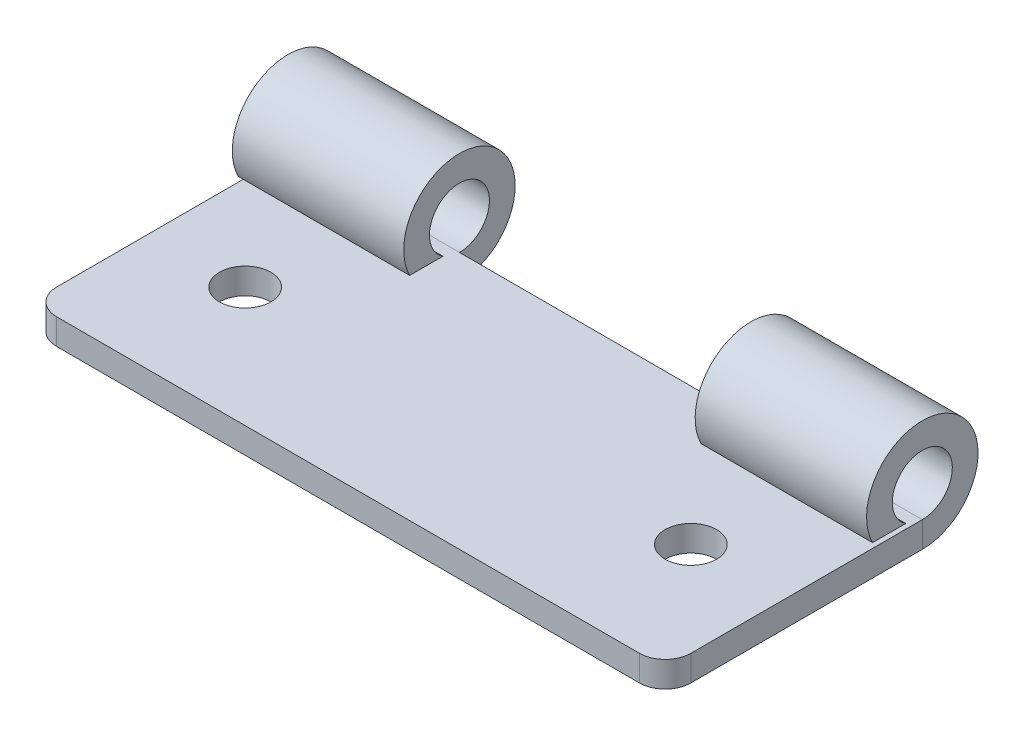
ISO-10303-21;
HEADER;
FILE_DESCRIPTION(('STEP AP214'),'2;1');
FILE_NAME('part.step','',(''),(''),'','','');
FILE_SCHEMA(('AUTOMOTIVE_DESIGN { 1 0 10303 214 1 1 1 1 }'));
ENDSEC;
DATA;
#1=APPLICATION_CONTEXT('core data for automotive mechanical design processes');
#2=APPLICATION_PROTOCOL_DEFINITION('international standard','automotive_design',2000,#1);
#3=PRODUCT_CONTEXT('',#1,'mechanical');
#4=PRODUCT('Part','Part','',(#3));
#5=PRODUCT_RELATED_PRODUCT_CATEGORY('part','',(#4));
#6=PRODUCT_DEFINITION_FORMATION('','',#4);
#7=PRODUCT_DEFINITION_CONTEXT('part definition',#1,'design');
#8=PRODUCT_DEFINITION('design','',#6,#7);
#9=PRODUCT_DEFINITION_SHAPE('','',#8);
#10=(LENGTH_UNIT() NAMED_UNIT(*) SI_UNIT(.MILLI.,.METRE.));
#11=(NAMED_UNIT(*) PLANE_ANGLE_UNIT() SI_UNIT($,.RADIAN.));
#12=(NAMED_UNIT(*) SI_UNIT($,.STERADIAN.) SOLID_ANGLE_UNIT());
#13=UNCERTAINTY_MEASURE_WITH_UNIT(LENGTH_MEASURE(1.E-05),#10,'distance_accuracy_value','');
#14=(GEOMETRIC_REPRESENTATION_CONTEXT(3) GLOBAL_UNCERTAINTY_ASSIGNED_CONTEXT((#13)) GLOBAL_UNIT_ASSIGNED_CONTEXT((#10,
#11,#12)) REPRESENTATION_CONTEXT('',''));
#15=CARTESIAN_POINT('',(0.,0.,0.));
#16=DIRECTION('',(0.,0.,1.));
#17=DIRECTION('',(1.,0.,0.));
#18=AXIS2_PLACEMENT_3D('',#15,#16,#17);
#19=CARTESIAN_POINT('',(0.,1.75,-15.));
#20=DIRECTION('',(1.,0.,0.));
#21=DIRECTION('',(0.,0.,-1.));
#22=AXIS2_PLACEMENT_3D('',#19,#20,#21);
#23=CYLINDRICAL_SURFACE('',#22,1.75);
#24=CARTESIAN_POINT('',(10.,1.75,-15.));
#25=DIRECTION('',(1.,0.,0.));
#26=DIRECTION('',(0.,0.,-1.));
#27=AXIS2_PLACEMENT_3D('',#24,#25,#26);
#28=CIRCLE('',#27,1.75);
#29=CARTESIAN_POINT('',(10.,0.,-15.));
#30=VERTEX_POINT('',#29);
#31=CARTESIAN_POINT('',(10.,0.289826786247609,-14.0354305697152));
#32=VERTEX_POINT('',#31);
#33=EDGE_CURVE('E64',#30,#32,#28,.T.);
#34=ORIENTED_EDGE('',*,*,#33,.T.);
#35=DIRECTION('',(1.,0.,0.));
#36=VECTOR('',#35,1.);
#37=CARTESIAN_POINT('',(0.,0.289826786247609,-14.0354305697152));
#38=LINE('',#37,#36);
#39=CARTESIAN_POINT('',(0.,0.289826786247609,-14.0354305697152));
#40=VERTEX_POINT('',#39);
#41=EDGE_CURVE('E96',#40,#32,#38,.T.);
#42=ORIENTED_EDGE('',*,*,#41,.F.);
#43=CARTESIAN_POINT('',(0.,1.75,-15.));
#44=DIRECTION('',(-1.,0.,0.));
#45=DIRECTION('',(0.,0.,-1.));
#46=AXIS2_PLACEMENT_3D('',#43,#44,#45);
#47=CIRCLE('',#46,1.75);
#48=CARTESIAN_POINT('',(0.,0.,-15.));
#49=VERTEX_POINT('',#48);
#50=EDGE_CURVE('E87',#40,#49,#47,.T.);
#51=ORIENTED_EDGE('',*,*,#50,.T.);
#52=DIRECTION('',(1.,0.,0.));
#53=VECTOR('',#52,1.);
#54=CARTESIAN_POINT('',(0.,0.,-15.));
#55=LINE('',#54,#53);
#56=EDGE_CURVE('E51',#49,#30,#55,.T.);
#57=ORIENTED_EDGE('',*,*,#56,.T.);
#58=EDGE_LOOP('',(#34,#42,#51,#57));
#59=FACE_BOUND('',#58,.T.);
#60=ADVANCED_FACE('F48',(#59),#23,.F.);
#61=CARTESIAN_POINT('',(0.,1.75,-15.));
#62=DIRECTION('',(1.,0.,0.));
#63=DIRECTION('',(0.,0.,-1.));
#64=AXIS2_PLACEMENT_3D('',#61,#62,#63);
#65=CYLINDRICAL_SURFACE('',#64,3.25);
#66=DIRECTION('',(1.,0.,0.));
#67=VECTOR('',#66,1.);
#68=CARTESIAN_POINT('',(0.,0.289826786247611,-12.0964858901944));
#69=LINE('',#68,#67);
#70=CARTESIAN_POINT('',(0.,0.289826786247611,-12.0964858901944));
#71=VERTEX_POINT('',#70);
#72=CARTESIAN_POINT('',(10.,0.289826786247609,-12.0964858901944));
#73=VERTEX_POINT('',#72);
#74=EDGE_CURVE('E103',#71,#73,#69,.T.);
#75=ORIENTED_EDGE('',*,*,#74,.T.);
#76=CARTESIAN_POINT('',(10.,1.75,-15.));
#77=DIRECTION('',(1.,0.,0.));
#78=DIRECTION('',(0.,0.,-1.));
#79=AXIS2_PLACEMENT_3D('',#76,#77,#78);
#80=CIRCLE('',#79,3.25);
#81=CARTESIAN_POINT('',(10.,-1.5,-15.));
#82=VERTEX_POINT('',#81);
#83=EDGE_CURVE('E111',#73,#82,#80,.F.);
#84=ORIENTED_EDGE('',*,*,#83,.T.);
#85=DIRECTION('',(1.,0.,0.));
#86=VECTOR('',#85,1.);
#87=CARTESIAN_POINT('',(0.,-1.5,-15.));
#88=LINE('',#87,#86);
#89=CARTESIAN_POINT('',(0.,-1.5,-15.));
#90=VERTEX_POINT('',#89);
#91=EDGE_CURVE('E99',#90,#82,#88,.T.);
#92=ORIENTED_EDGE('',*,*,#91,.F.);
#93=CARTESIAN_POINT('',(0.,1.75,-15.));
#94=DIRECTION('',(1.,0.,0.));
#95=DIRECTION('',(0.,0.,-1.));
#96=AXIS2_PLACEMENT_3D('',#93,#94,#95);
#97=CIRCLE('',#96,3.25);
#98=EDGE_CURVE('E105',#90,#71,#97,.T.);
#99=ORIENTED_EDGE('',*,*,#98,.T.);
#100=EDGE_LOOP('',(#75,#84,#92,#99));
#101=FACE_BOUND('',#100,.T.);
#102=ADVANCED_FACE('F122',(#101),#65,.T.);
#103=CARTESIAN_POINT('',(0.,0.289826786247609,-14.0354305697152));
#104=DIRECTION('',(0.,-1.,0.));
#105=DIRECTION('',(0.,0.,-1.));
#106=AXIS2_PLACEMENT_3D('',#103,#104,#105);
#107=PLANE('',#106);
#108=DIRECTION('',(0.,0.,-1.));
#109=VECTOR('',#108,1.);
#110=CARTESIAN_POINT('',(10.,0.289826786247609,-14.0354305697152));
#111=LINE('',#110,#109);
#112=EDGE_CURVE('E12',#73,#32,#111,.T.);
#113=ORIENTED_EDGE('',*,*,#112,.F.);
#114=ORIENTED_EDGE('',*,*,#74,.F.);
#115=DIRECTION('',(0.,0.,-1.));
#116=VECTOR('',#115,1.);
#117=CARTESIAN_POINT('',(0.,0.289826786247609,-14.0354305697152));
#118=LINE('',#117,#116);
#119=EDGE_CURVE('E91',#71,#40,#118,.T.);
#120=ORIENTED_EDGE('',*,*,#119,.T.);
#121=ORIENTED_EDGE('',*,*,#41,.T.);
#122=EDGE_LOOP('',(#113,#114,#120,#121));
#123=FACE_BOUND('',#122,.T.);
#124=ADVANCED_FACE('F101',(#123),#107,.T.);
#125=CARTESIAN_POINT('',(0.,0.,-15.));
#126=DIRECTION('',(0.,0.,1.));
#127=DIRECTION('',(1.,0.,0.));
#128=AXIS2_PLACEMENT_3D('',#125,#126,#127);
#129=PLANE('',#128);
#130=ORIENTED_EDGE('',*,*,#91,.T.);
#131=DIRECTION('',(0.,1.,0.));
#132=VECTOR('',#131,1.);
#133=CARTESIAN_POINT('',(10.,0.,-15.));
#134=LINE('',#133,#132);
#135=EDGE_CURVE('E109',#82,#30,#134,.T.);
#136=ORIENTED_EDGE('',*,*,#135,.T.);
#137=ORIENTED_EDGE('',*,*,#56,.F.);
#138=DIRECTION('',(0.,-1.,0.));
#139=VECTOR('',#138,1.);
#140=CARTESIAN_POINT('',(0.,0.,-15.));
#141=LINE('',#140,#139);
#142=EDGE_CURVE('E57',#49,#90,#141,.T.);
#143=ORIENTED_EDGE('',*,*,#142,.T.);
#144=EDGE_LOOP('',(#130,#136,#137,#143));
#145=FACE_BOUND('',#144,.T.);
#146=ADVANCED_FACE('F118',(#145),#129,.T.);
#147=CARTESIAN_POINT('',(0.,1.75,-15.));
#148=DIRECTION('',(1.,0.,0.));
#149=DIRECTION('',(0.,0.,-1.));
#150=AXIS2_PLACEMENT_3D('',#147,#148,#149);
#151=PLANE('',#150);
#152=ORIENTED_EDGE('',*,*,#50,.F.);
#153=ORIENTED_EDGE('',*,*,#119,.F.);
#154=ORIENTED_EDGE('',*,*,#98,.F.);
#155=ORIENTED_EDGE('',*,*,#142,.F.);
#156=EDGE_LOOP('',(#152,#153,#154,#155));
#157=FACE_BOUND('',#156,.T.);
#158=ADVANCED_FACE('F88',(#157),#151,.F.);
#159=CARTESIAN_POINT('',(10.,10.,-15.));
#160=DIRECTION('',(1.,0.,0.));
#161=DIRECTION('',(0.,0.,-1.));
#162=AXIS2_PLACEMENT_3D('',#159,#160,#161);
#163=PLANE('',#162);
#164=ORIENTED_EDGE('',*,*,#135,.F.);
#165=ORIENTED_EDGE('',*,*,#83,.F.);
#166=ORIENTED_EDGE('',*,*,#112,.T.);
#167=ORIENTED_EDGE('',*,*,#33,.F.);
#168=EDGE_LOOP('',(#164,#165,#166,#167));
#169=FACE_BOUND('',#168,.T.);
#170=ADVANCED_FACE('F120',(#169),#163,.T.);
#171=CLOSED_SHELL('',(#60,#102,#124,#146,#158,#170));
#172=MANIFOLD_SOLID_BREP('B2',#171);
#173=CARTESIAN_POINT('',(37.,1.75,-15.));
#174=DIRECTION('',(1.,0.,0.));
#175=DIRECTION('',(0.,0.,-1.));
#176=AXIS2_PLACEMENT_3D('',#173,#174,#175);
#177=PLANE('',#176);
#178=CARTESIAN_POINT('',(37.,1.75,-15.));
#179=DIRECTION('',(-1.,0.,0.));
#180=DIRECTION('',(0.,0.,-1.));
#181=AXIS2_PLACEMENT_3D('',#178,#179,#180);
#182=CIRCLE('',#181,1.75);
#183=CARTESIAN_POINT('',(37.,0.289826786247609,-14.0354305697152));
#184=VERTEX_POINT('',#183);
#185=CARTESIAN_POINT('',(37.,0.,-15.));
#186=VERTEX_POINT('',#185);
#187=EDGE_CURVE('E250',#184,#186,#182,.T.);
#188=ORIENTED_EDGE('',*,*,#187,.T.);
#189=DIRECTION('',(0.,-1.,0.));
#190=VECTOR('',#189,1.);
#191=CARTESIAN_POINT('',(37.,0.,-15.));
#192=LINE('',#191,#190);
#193=CARTESIAN_POINT('',(37.,-1.5,-15.));
#194=VERTEX_POINT('',#193);
#195=EDGE_CURVE('E242',#186,#194,#192,.T.);
#196=ORIENTED_EDGE('',*,*,#195,.T.);
#197=CARTESIAN_POINT('',(37.,1.75,-15.));
#198=DIRECTION('',(1.,0.,0.));
#199=DIRECTION('',(0.,0.,-1.));
#200=AXIS2_PLACEMENT_3D('',#197,#198,#199);
#201=CIRCLE('',#200,3.25);
#202=CARTESIAN_POINT('',(37.,0.289826786247611,-12.0964858901944));
#203=VERTEX_POINT('',#202);
#204=EDGE_CURVE('E262',#194,#203,#201,.T.);
#205=ORIENTED_EDGE('',*,*,#204,.T.);
#206=DIRECTION('',(0.,0.,-1.));
#207=VECTOR('',#206,1.);
#208=CARTESIAN_POINT('',(37.,0.289826786247609,-14.0354305697152));
#209=LINE('',#208,#207);
#210=EDGE_CURVE('E258',#203,#184,#209,.T.);
#211=ORIENTED_EDGE('',*,*,#210,.T.);
#212=EDGE_LOOP('',(#188,#196,#205,#211));
#213=FACE_BOUND('',#212,.T.);
#214=ADVANCED_FACE('F197',(#213),#177,.T.);
#215=CARTESIAN_POINT('',(0.,0.,-15.));
#216=DIRECTION('',(0.,0.,1.));
#217=DIRECTION('',(1.,0.,0.));
#218=AXIS2_PLACEMENT_3D('',#215,#216,#217);
#219=PLANE('',#218);
#220=DIRECTION('',(1.,0.,0.));
#221=VECTOR('',#220,1.);
#222=CARTESIAN_POINT('',(0.,0.,-15.));
#223=LINE('',#222,#221);
#224=CARTESIAN_POINT('',(27.,0.,-15.));
#225=VERTEX_POINT('',#224);
#226=EDGE_CURVE('E257',#225,#186,#223,.T.);
#227=ORIENTED_EDGE('',*,*,#226,.F.);
#228=DIRECTION('',(0.,-1.,0.));
#229=VECTOR('',#228,1.);
#230=CARTESIAN_POINT('',(27.,0.,-15.));
#231=LINE('',#230,#229);
#232=CARTESIAN_POINT('',(27.,-1.5,-15.));
#233=VERTEX_POINT('',#232);
#234=EDGE_CURVE('E46',#225,#233,#231,.T.);
#235=ORIENTED_EDGE('',*,*,#234,.T.);
#236=DIRECTION('',(1.,0.,0.));
#237=VECTOR('',#236,1.);
#238=CARTESIAN_POINT('',(0.,-1.5,-15.));
#239=LINE('',#238,#237);
#240=EDGE_CURVE('E252',#233,#194,#239,.T.);
#241=ORIENTED_EDGE('',*,*,#240,.T.);
#242=ORIENTED_EDGE('',*,*,#195,.F.);
#243=EDGE_LOOP('',(#227,#235,#241,#242));
#244=FACE_BOUND('',#243,.T.);
#245=ADVANCED_FACE('F199',(#244),#219,.T.);
#246=CARTESIAN_POINT('',(27.,10.,-15.));
#247=DIRECTION('',(-1.,0.,0.));
#248=DIRECTION('',(0.,0.,1.));
#249=AXIS2_PLACEMENT_3D('',#246,#247,#248);
#250=PLANE('',#249);
#251=CARTESIAN_POINT('',(27.,1.75,-15.));
#252=DIRECTION('',(-1.,0.,0.));
#253=DIRECTION('',(0.,0.,1.));
#254=AXIS2_PLACEMENT_3D('',#251,#252,#253);
#255=CIRCLE('',#254,1.75);
#256=CARTESIAN_POINT('',(27.,0.289826786247609,-14.0354305697152));
#257=VERTEX_POINT('',#256);
#258=EDGE_CURVE('E236',#257,#225,#255,.T.);
#259=ORIENTED_EDGE('',*,*,#258,.F.);
#260=DIRECTION('',(0.,0.,1.));
#261=VECTOR('',#260,1.);
#262=CARTESIAN_POINT('',(27.,0.289826786247609,-14.0354305697152));
#263=LINE('',#262,#261);
#264=CARTESIAN_POINT('',(27.,0.289826786247609,-12.0964858901944));
#265=VERTEX_POINT('',#264);
#266=EDGE_CURVE('E238',#257,#265,#263,.T.);
#267=ORIENTED_EDGE('',*,*,#266,.T.);
#268=CARTESIAN_POINT('',(27.,1.75,-15.));
#269=DIRECTION('',(-1.,0.,0.));
#270=DIRECTION('',(0.,0.,1.));
#271=AXIS2_PLACEMENT_3D('',#268,#269,#270);
#272=CIRCLE('',#271,3.25);
#273=EDGE_CURVE('E212',#233,#265,#272,.F.);
#274=ORIENTED_EDGE('',*,*,#273,.F.);
#275=ORIENTED_EDGE('',*,*,#234,.F.);
#276=EDGE_LOOP('',(#259,#267,#274,#275));
#277=FACE_BOUND('',#276,.T.);
#278=ADVANCED_FACE('F237',(#277),#250,.T.);
#279=CARTESIAN_POINT('',(0.,0.289826786247609,-14.0354305697152));
#280=DIRECTION('',(0.,-1.,0.));
#281=DIRECTION('',(0.,0.,-1.));
#282=AXIS2_PLACEMENT_3D('',#279,#280,#281);
#283=PLANE('',#282);
#284=ORIENTED_EDGE('',*,*,#266,.F.);
#285=DIRECTION('',(1.,0.,0.));
#286=VECTOR('',#285,1.);
#287=CARTESIAN_POINT('',(0.,0.289826786247609,-14.0354305697152));
#288=LINE('',#287,#286);
#289=EDGE_CURVE('E205',#257,#184,#288,.T.);
#290=ORIENTED_EDGE('',*,*,#289,.T.);
#291=ORIENTED_EDGE('',*,*,#210,.F.);
#292=DIRECTION('',(1.,0.,0.));
#293=VECTOR('',#292,1.);
#294=CARTESIAN_POINT('',(0.,0.289826786247611,-12.0964858901944));
#295=LINE('',#294,#293);
#296=EDGE_CURVE('E245',#265,#203,#295,.T.);
#297=ORIENTED_EDGE('',*,*,#296,.F.);
#298=EDGE_LOOP('',(#284,#290,#291,#297));
#299=FACE_BOUND('',#298,.T.);
#300=ADVANCED_FACE('F244',(#299),#283,.T.);
#301=CARTESIAN_POINT('',(0.,1.75,-15.));
#302=DIRECTION('',(1.,0.,0.));
#303=DIRECTION('',(0.,0.,-1.));
#304=AXIS2_PLACEMENT_3D('',#301,#302,#303);
#305=CYLINDRICAL_SURFACE('',#304,3.25);
#306=ORIENTED_EDGE('',*,*,#273,.T.);
#307=ORIENTED_EDGE('',*,*,#296,.T.);
#308=ORIENTED_EDGE('',*,*,#204,.F.);
#309=ORIENTED_EDGE('',*,*,#240,.F.);
#310=EDGE_LOOP('',(#306,#307,#308,#309));
#311=FACE_BOUND('',#310,.T.);
#312=ADVANCED_FACE('F269',(#311),#305,.T.);
#313=CARTESIAN_POINT('',(0.,1.75,-15.));
#314=DIRECTION('',(1.,0.,0.));
#315=DIRECTION('',(0.,0.,-1.));
#316=AXIS2_PLACEMENT_3D('',#313,#314,#315);
#317=CYLINDRICAL_SURFACE('',#316,1.75);
#318=ORIENTED_EDGE('',*,*,#289,.F.);
#319=ORIENTED_EDGE('',*,*,#258,.T.);
#320=ORIENTED_EDGE('',*,*,#226,.T.);
#321=ORIENTED_EDGE('',*,*,#187,.F.);
#322=EDGE_LOOP('',(#318,#319,#320,#321));
#323=FACE_BOUND('',#322,.T.);
#324=ADVANCED_FACE('F248',(#323),#317,.F.);
#325=CLOSED_SHELL('',(#214,#245,#278,#300,#312,#324));
#326=MANIFOLD_SOLID_BREP('B6',#325);
#327=CARTESIAN_POINT('',(0.,-1.5,0.));
#328=DIRECTION('',(-1.,0.,0.));
#329=DIRECTION('',(0.,0.,1.));
#330=AXIS2_PLACEMENT_3D('',#327,#328,#329);
#331=PLANE('',#330);
#332=DIRECTION('',(0.,0.,1.));
#333=VECTOR('',#332,1.);
#334=CARTESIAN_POINT('',(0.,-1.5,0.));
#335=LINE('',#334,#333);
#336=CARTESIAN_POINT('',(0.,-1.5,-15.));
#337=VERTEX_POINT('',#336);
#338=CARTESIAN_POINT('',(0.,-1.5,-1.5));
#339=VERTEX_POINT('',#338);
#340=EDGE_CURVE('E407',#337,#339,#335,.T.);
#341=ORIENTED_EDGE('',*,*,#340,.T.);
#342=DIRECTION('',(0.,1.,0.));
#343=VECTOR('',#342,1.);
#344=CARTESIAN_POINT('',(0.,-1.5,-1.5));
#345=LINE('',#344,#343);
#346=CARTESIAN_POINT('',(0.,0.,-1.5));
#347=VERTEX_POINT('',#346);
#348=EDGE_CURVE('E421',#339,#347,#345,.T.);
#349=ORIENTED_EDGE('',*,*,#348,.T.);
#350=DIRECTION('',(0.,0.,1.));
#351=VECTOR('',#350,1.);
#352=CARTESIAN_POINT('',(0.,0.,0.));
#353=LINE('',#352,#351);
#354=CARTESIAN_POINT('',(0.,0.,-15.));
#355=VERTEX_POINT('',#354);
#356=EDGE_CURVE('E411',#355,#347,#353,.T.);
#357=ORIENTED_EDGE('',*,*,#356,.F.);
#358=DIRECTION('',(0.,1.,0.));
#359=VECTOR('',#358,1.);
#360=CARTESIAN_POINT('',(0.,-1.5,-15.));
#361=LINE('',#360,#359);
#362=EDGE_CURVE('E402',#337,#355,#361,.T.);
#363=ORIENTED_EDGE('',*,*,#362,.F.);
#364=EDGE_LOOP('',(#341,#349,#357,#363));
#365=FACE_BOUND('',#364,.T.);
#366=ADVANCED_FACE('F337',(#365),#331,.T.);
#367=CARTESIAN_POINT('',(0.,-1.5,-15.));
#368=DIRECTION('',(0.,0.,-1.));
#369=DIRECTION('',(-1.,0.,0.));
#370=AXIS2_PLACEMENT_3D('',#367,#368,#369);
#371=PLANE('',#370);
#372=DIRECTION('',(-1.,0.,0.));
#373=VECTOR('',#372,1.);
#374=CARTESIAN_POINT('',(0.,-1.5,-15.));
#375=LINE('',#374,#373);
#376=CARTESIAN_POINT('',(37.,-1.5,-15.));
#377=VERTEX_POINT('',#376);
#378=EDGE_CURVE('E394',#377,#337,#375,.T.);
#379=ORIENTED_EDGE('',*,*,#378,.T.);
#380=ORIENTED_EDGE('',*,*,#362,.T.);
#381=DIRECTION('',(-1.,0.,0.));
#382=VECTOR('',#381,1.);
#383=CARTESIAN_POINT('',(0.,0.,-15.));
#384=LINE('',#383,#382);
#385=CARTESIAN_POINT('',(37.,0.,-15.));
#386=VERTEX_POINT('',#385);
#387=EDGE_CURVE('E401',#386,#355,#384,.T.);
#388=ORIENTED_EDGE('',*,*,#387,.F.);
#389=DIRECTION('',(0.,1.,0.));
#390=VECTOR('',#389,1.);
#391=CARTESIAN_POINT('',(37.,-1.5,-15.));
#392=LINE('',#391,#390);
#393=EDGE_CURVE('E391',#377,#386,#392,.T.);
#394=ORIENTED_EDGE('',*,*,#393,.F.);
#395=EDGE_LOOP('',(#379,#380,#388,#394));
#396=FACE_BOUND('',#395,.T.);
#397=ADVANCED_FACE('F398',(#396),#371,.T.);
#398=CARTESIAN_POINT('',(37.,-1.5,0.));
#399=DIRECTION('',(1.,0.,0.));
#400=DIRECTION('',(0.,0.,-1.));
#401=AXIS2_PLACEMENT_3D('',#398,#399,#400);
#402=PLANE('',#401);
#403=DIRECTION('',(0.,0.,-1.));
#404=VECTOR('',#403,1.);
#405=CARTESIAN_POINT('',(37.,0.,0.));
#406=LINE('',#405,#404);
#407=CARTESIAN_POINT('',(37.,0.,-1.5));
#408=VERTEX_POINT('',#407);
#409=EDGE_CURVE('E418',#408,#386,#406,.T.);
#410=ORIENTED_EDGE('',*,*,#409,.F.);
#411=DIRECTION('',(0.,1.,0.));
#412=VECTOR('',#411,1.);
#413=CARTESIAN_POINT('',(37.,-1.5,-1.5));
#414=LINE('',#413,#412);
#415=CARTESIAN_POINT('',(37.,-1.5,-1.5));
#416=VERTEX_POINT('',#415);
#417=EDGE_CURVE('E195',#408,#416,#414,.F.);
#418=ORIENTED_EDGE('',*,*,#417,.T.);
#419=DIRECTION('',(0.,0.,-1.));
#420=VECTOR('',#419,1.);
#421=CARTESIAN_POINT('',(37.,-1.5,0.));
#422=LINE('',#421,#420);
#423=EDGE_CURVE('E388',#416,#377,#422,.T.);
#424=ORIENTED_EDGE('',*,*,#423,.T.);
#425=ORIENTED_EDGE('',*,*,#393,.T.);
#426=EDGE_LOOP('',(#410,#418,#424,#425));
#427=FACE_BOUND('',#426,.T.);
#428=ADVANCED_FACE('F390',(#427),#402,.T.);
#429=CARTESIAN_POINT('',(0.,-1.5,0.));
#430=DIRECTION('',(0.,0.,1.));
#431=DIRECTION('',(1.,0.,0.));
#432=AXIS2_PLACEMENT_3D('',#429,#430,#431);
#433=PLANE('',#432);
#434=DIRECTION('',(1.,0.,0.));
#435=VECTOR('',#434,1.);
#436=CARTESIAN_POINT('',(0.,0.,0.));
#437=LINE('',#436,#435);
#438=CARTESIAN_POINT('',(1.5,0.,0.));
#439=VERTEX_POINT('',#438);
#440=CARTESIAN_POINT('',(35.5,0.,0.));
#441=VERTEX_POINT('',#440);
#442=EDGE_CURVE('E414',#439,#441,#437,.T.);
#443=ORIENTED_EDGE('',*,*,#442,.F.);
#444=DIRECTION('',(0.,1.,0.));
#445=VECTOR('',#444,1.);
#446=CARTESIAN_POINT('',(1.5,-1.5,0.));
#447=LINE('',#446,#445);
#448=CARTESIAN_POINT('',(1.5,-1.5,0.));
#449=VERTEX_POINT('',#448);
#450=EDGE_CURVE('E432',#439,#449,#447,.F.);
#451=ORIENTED_EDGE('',*,*,#450,.T.);
#452=DIRECTION('',(1.,0.,0.));
#453=VECTOR('',#452,1.);
#454=CARTESIAN_POINT('',(0.,-1.5,0.));
#455=LINE('',#454,#453);
#456=CARTESIAN_POINT('',(35.5,-1.5,0.));
#457=VERTEX_POINT('',#456);
#458=EDGE_CURVE('E395',#449,#457,#455,.T.);
#459=ORIENTED_EDGE('',*,*,#458,.T.);
#460=DIRECTION('',(0.,1.,0.));
#461=VECTOR('',#460,1.);
#462=CARTESIAN_POINT('',(35.5,-1.5,0.));
#463=LINE('',#462,#461);
#464=EDGE_CURVE('E429',#457,#441,#463,.T.);
#465=ORIENTED_EDGE('',*,*,#464,.T.);
#466=EDGE_LOOP('',(#443,#451,#459,#465));
#467=FACE_BOUND('',#466,.T.);
#468=ADVANCED_FACE('F447',(#467),#433,.T.);
#469=CARTESIAN_POINT('',(0.,-1.5,0.));
#470=DIRECTION('',(0.,-1.,0.));
#471=DIRECTION('',(0.,0.,-1.));
#472=AXIS2_PLACEMENT_3D('',#469,#470,#471);
#473=PLANE('',#472);
#474=CARTESIAN_POINT('',(31.5,-1.5,-7.));
#475=DIRECTION('',(0.,1.,0.));
#476=DIRECTION('',(0.,0.,1.));
#477=AXIS2_PLACEMENT_3D('',#474,#475,#476);
#478=CIRCLE('',#477,1.5);
#479=CARTESIAN_POINT('',(31.5,-1.5,-5.5));
#480=VERTEX_POINT('',#479);
#481=EDGE_CURVE('E482',#480,#480,#478,.T.);
#482=ORIENTED_EDGE('',*,*,#481,.T.);
#483=EDGE_LOOP('',(#482));
#484=FACE_BOUND('',#483,.T.);
#485=CARTESIAN_POINT('',(5.5,-1.5,-7.));
#486=DIRECTION('',(0.,1.,0.));
#487=DIRECTION('',(0.,0.,1.));
#488=AXIS2_PLACEMENT_3D('',#485,#486,#487);
#489=CIRCLE('',#488,1.5);
#490=CARTESIAN_POINT('',(5.5,-1.5,-5.5));
#491=VERTEX_POINT('',#490);
#492=EDGE_CURVE('E415',#491,#491,#489,.T.);
#493=ORIENTED_EDGE('',*,*,#492,.T.);
#494=EDGE_LOOP('',(#493));
#495=FACE_BOUND('',#494,.T.);
#496=ORIENTED_EDGE('',*,*,#458,.F.);
#497=CARTESIAN_POINT('',(1.5,-1.5,-1.5));
#498=DIRECTION('',(0.,-1.,0.));
#499=DIRECTION('',(0.,0.,-1.));
#500=AXIS2_PLACEMENT_3D('',#497,#498,#499);
#501=CIRCLE('',#500,1.5);
#502=EDGE_CURVE('E345',#449,#339,#501,.T.);
#503=ORIENTED_EDGE('',*,*,#502,.T.);
#504=ORIENTED_EDGE('',*,*,#340,.F.);
#505=ORIENTED_EDGE('',*,*,#378,.F.);
#506=ORIENTED_EDGE('',*,*,#423,.F.);
#507=CARTESIAN_POINT('',(35.5,-1.5,-1.5));
#508=DIRECTION('',(0.,-1.,0.));
#509=DIRECTION('',(0.,0.,-1.));
#510=AXIS2_PLACEMENT_3D('',#507,#508,#509);
#511=CIRCLE('',#510,1.5);
#512=EDGE_CURVE('E357',#416,#457,#511,.T.);
#513=ORIENTED_EDGE('',*,*,#512,.T.);
#514=EDGE_LOOP('',(#496,#503,#504,#505,#506,#513));
#515=FACE_BOUND('',#514,.T.);
#516=ADVANCED_FACE('F405',(#484,#495,#515),#473,.T.);
#517=CARTESIAN_POINT('',(0.,0.,0.));
#518=DIRECTION('',(0.,-1.,0.));
#519=DIRECTION('',(0.,0.,-1.));
#520=AXIS2_PLACEMENT_3D('',#517,#518,#519);
#521=PLANE('',#520);
#522=ORIENTED_EDGE('',*,*,#356,.T.);
#523=CARTESIAN_POINT('',(1.5,0.,-1.5));
#524=DIRECTION('',(0.,-1.,0.));
#525=DIRECTION('',(0.,0.,-1.));
#526=AXIS2_PLACEMENT_3D('',#523,#524,#525);
#527=CIRCLE('',#526,1.5);
#528=EDGE_CURVE('E427',#347,#439,#527,.F.);
#529=ORIENTED_EDGE('',*,*,#528,.T.);
#530=ORIENTED_EDGE('',*,*,#442,.T.);
#531=CARTESIAN_POINT('',(35.5,0.,-1.5));
#532=DIRECTION('',(0.,-1.,0.));
#533=DIRECTION('',(0.,0.,-1.));
#534=AXIS2_PLACEMENT_3D('',#531,#532,#533);
#535=CIRCLE('',#534,1.5);
#536=EDGE_CURVE('E425',#441,#408,#535,.F.);
#537=ORIENTED_EDGE('',*,*,#536,.T.);
#538=ORIENTED_EDGE('',*,*,#409,.T.);
#539=ORIENTED_EDGE('',*,*,#387,.T.);
#540=EDGE_LOOP('',(#522,#529,#530,#537,#538,#539));
#541=FACE_BOUND('',#540,.T.);
#542=CARTESIAN_POINT('',(5.5,0.,-7.));
#543=DIRECTION('',(0.,1.,0.));
#544=DIRECTION('',(0.,0.,1.));
#545=AXIS2_PLACEMENT_3D('',#542,#543,#544);
#546=CIRCLE('',#545,1.5);
#547=CARTESIAN_POINT('',(5.5,0.,-5.5));
#548=VERTEX_POINT('',#547);
#549=EDGE_CURVE('E488',#548,#548,#546,.T.);
#550=ORIENTED_EDGE('',*,*,#549,.F.);
#551=EDGE_LOOP('',(#550));
#552=FACE_BOUND('',#551,.T.);
#553=CARTESIAN_POINT('',(31.5,0.,-7.));
#554=DIRECTION('',(0.,1.,0.));
#555=DIRECTION('',(0.,0.,1.));
#556=AXIS2_PLACEMENT_3D('',#553,#554,#555);
#557=CIRCLE('',#556,1.5);
#558=CARTESIAN_POINT('',(31.5,0.,-5.5));
#559=VERTEX_POINT('',#558);
#560=EDGE_CURVE('E485',#559,#559,#557,.T.);
#561=ORIENTED_EDGE('',*,*,#560,.F.);
#562=EDGE_LOOP('',(#561));
#563=FACE_BOUND('',#562,.T.);
#564=ADVANCED_FACE('F444',(#541,#552,#563),#521,.F.);
#565=CARTESIAN_POINT('',(5.5,-1.5,-7.));
#566=DIRECTION('',(0.,1.,0.));
#567=DIRECTION('',(0.,0.,1.));
#568=AXIS2_PLACEMENT_3D('',#565,#566,#567);
#569=CYLINDRICAL_SURFACE('',#568,1.5);
#570=ORIENTED_EDGE('',*,*,#492,.F.);
#571=EDGE_LOOP('',(#570));
#572=FACE_BOUND('',#571,.T.);
#573=ORIENTED_EDGE('',*,*,#549,.T.);
#574=EDGE_LOOP('',(#573));
#575=FACE_BOUND('',#574,.T.);
#576=ADVANCED_FACE('F468',(#572,#575),#569,.F.);
#577=CARTESIAN_POINT('',(31.5,-1.5,-7.));
#578=DIRECTION('',(0.,1.,0.));
#579=DIRECTION('',(0.,0.,1.));
#580=AXIS2_PLACEMENT_3D('',#577,#578,#579);
#581=CYLINDRICAL_SURFACE('',#580,1.5);
#582=ORIENTED_EDGE('',*,*,#481,.F.);
#583=EDGE_LOOP('',(#582));
#584=FACE_BOUND('',#583,.T.);
#585=ORIENTED_EDGE('',*,*,#560,.T.);
#586=EDGE_LOOP('',(#585));
#587=FACE_BOUND('',#586,.T.);
#588=ADVANCED_FACE('F454',(#584,#587),#581,.F.);
#589=CARTESIAN_POINT('',(1.5,-1.5,-1.5));
#590=DIRECTION('',(0.,1.,0.));
#591=DIRECTION('',(0.,0.,1.));
#592=AXIS2_PLACEMENT_3D('',#589,#590,#591);
#593=CYLINDRICAL_SURFACE('',#592,1.5);
#594=ORIENTED_EDGE('',*,*,#502,.F.);
#595=ORIENTED_EDGE('',*,*,#450,.F.);
#596=ORIENTED_EDGE('',*,*,#528,.F.);
#597=ORIENTED_EDGE('',*,*,#348,.F.);
#598=EDGE_LOOP('',(#594,#595,#596,#597));
#599=FACE_BOUND('',#598,.T.);
#600=ADVANCED_FACE('F441',(#599),#593,.T.);
#601=CARTESIAN_POINT('',(35.5,-1.5,-1.5));
#602=DIRECTION('',(0.,1.,0.));
#603=DIRECTION('',(0.,0.,1.));
#604=AXIS2_PLACEMENT_3D('',#601,#602,#603);
#605=CYLINDRICAL_SURFACE('',#604,1.5);
#606=ORIENTED_EDGE('',*,*,#512,.F.);
#607=ORIENTED_EDGE('',*,*,#417,.F.);
#608=ORIENTED_EDGE('',*,*,#536,.F.);
#609=ORIENTED_EDGE('',*,*,#464,.F.);
#610=EDGE_LOOP('',(#606,#607,#608,#609));
#611=FACE_BOUND('',#610,.T.);
#612=ADVANCED_FACE('F339',(#611),#605,.T.);
#613=CLOSED_SHELL('',(#366,#397,#428,#468,#516,#564,#576,#588,#600,#612));
#614=MANIFOLD_SOLID_BREP('B40',#613);
#615=ADVANCED_BREP_SHAPE_REPRESENTATION('',(#18,#172,#326,#614),#14);
#616=SHAPE_DEFINITION_REPRESENTATION(#9,#615);
ENDSEC;
END-ISO-10303-21;
